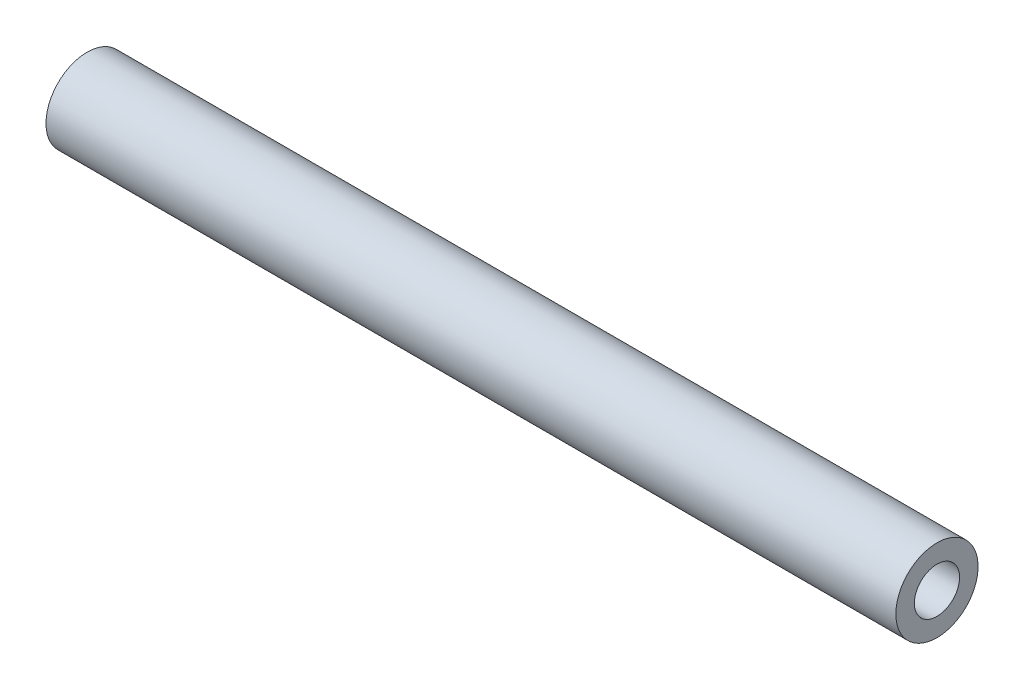
ISO-10303-21;
HEADER;
FILE_DESCRIPTION(('STEP AP214'),'2;1');
FILE_NAME('part.step','',(''),(''),'','','');
FILE_SCHEMA(('AUTOMOTIVE_DESIGN { 1 0 10303 214 1 1 1 1 }'));
ENDSEC;
DATA;
#1=APPLICATION_CONTEXT('core data for automotive mechanical design processes');
#2=APPLICATION_PROTOCOL_DEFINITION('international standard','automotive_design',2000,#1);
#3=PRODUCT_CONTEXT('',#1,'mechanical');
#4=PRODUCT('Part','Part','',(#3));
#5=PRODUCT_RELATED_PRODUCT_CATEGORY('part','',(#4));
#6=PRODUCT_DEFINITION_FORMATION('','',#4);
#7=PRODUCT_DEFINITION_CONTEXT('part definition',#1,'design');
#8=PRODUCT_DEFINITION('design','',#6,#7);
#9=PRODUCT_DEFINITION_SHAPE('','',#8);
#10=(LENGTH_UNIT() NAMED_UNIT(*) SI_UNIT(.MILLI.,.METRE.));
#11=(NAMED_UNIT(*) PLANE_ANGLE_UNIT() SI_UNIT($,.RADIAN.));
#12=(NAMED_UNIT(*) SI_UNIT($,.STERADIAN.) SOLID_ANGLE_UNIT());
#13=UNCERTAINTY_MEASURE_WITH_UNIT(LENGTH_MEASURE(1.E-05),#10,'distance_accuracy_value','');
#14=(GEOMETRIC_REPRESENTATION_CONTEXT(3) GLOBAL_UNCERTAINTY_ASSIGNED_CONTEXT((#13)) GLOBAL_UNIT_ASSIGNED_CONTEXT((#10,
#11,#12)) REPRESENTATION_CONTEXT('',''));
#15=CARTESIAN_POINT('',(0.,0.,0.));
#16=DIRECTION('',(0.,0.,1.));
#17=DIRECTION('',(1.,0.,0.));
#18=AXIS2_PLACEMENT_3D('',#15,#16,#17);
#19=CARTESIAN_POINT('',(-32.,-12.,-20.));
#20=DIRECTION('',(-1.,0.,0.));
#21=DIRECTION('',(0.,0.,1.));
#22=AXIS2_PLACEMENT_3D('',#19,#20,#21);
#23=CYLINDRICAL_SURFACE('',#22,1.65);
#24=CARTESIAN_POINT('',(31.,-12.,-20.));
#25=DIRECTION('',(-1.,0.,0.));
#26=DIRECTION('',(0.,0.,1.));
#27=AXIS2_PLACEMENT_3D('',#24,#25,#26);
#28=CIRCLE('',#27,1.65);
#29=CARTESIAN_POINT('',(31.,-12.,-18.35));
#30=VERTEX_POINT('',#29);
#31=EDGE_CURVE('E27',#30,#30,#28,.T.);
#32=ORIENTED_EDGE('',*,*,#31,.F.);
#33=EDGE_LOOP('',(#32));
#34=FACE_BOUND('',#33,.T.);
#35=CARTESIAN_POINT('',(-31.,-12.,-20.));
#36=DIRECTION('',(-1.,0.,0.));
#37=DIRECTION('',(0.,0.,1.));
#38=AXIS2_PLACEMENT_3D('',#35,#36,#37);
#39=CIRCLE('',#38,1.65);
#40=CARTESIAN_POINT('',(-31.,-12.,-18.35));
#41=VERTEX_POINT('',#40);
#42=EDGE_CURVE('E18',#41,#41,#39,.T.);
#43=ORIENTED_EDGE('',*,*,#42,.T.);
#44=EDGE_LOOP('',(#43));
#45=FACE_BOUND('',#44,.T.);
#46=ADVANCED_FACE('F15',(#34,#45),#23,.F.);
#47=CARTESIAN_POINT('',(-31.,-12.,-20.));
#48=DIRECTION('',(1.,0.,0.));
#49=DIRECTION('',(0.,0.,-1.));
#50=AXIS2_PLACEMENT_3D('',#47,#48,#49);
#51=PLANE('',#50);
#52=ORIENTED_EDGE('',*,*,#42,.F.);
#53=EDGE_LOOP('',(#52));
#54=FACE_BOUND('',#53,.T.);
#55=CARTESIAN_POINT('',(-31.,-12.,-20.));
#56=DIRECTION('',(-1.,0.,0.));
#57=DIRECTION('',(0.,0.,1.));
#58=AXIS2_PLACEMENT_3D('',#55,#56,#57);
#59=CIRCLE('',#58,3.);
#60=CARTESIAN_POINT('',(-31.,-12.,-17.));
#61=VERTEX_POINT('',#60);
#62=EDGE_CURVE('E22',#61,#61,#59,.F.);
#63=ORIENTED_EDGE('',*,*,#62,.F.);
#64=EDGE_LOOP('',(#63));
#65=FACE_BOUND('',#64,.T.);
#66=ADVANCED_FACE('F36',(#54,#65),#51,.F.);
#67=CARTESIAN_POINT('',(31.,-12.,-20.));
#68=DIRECTION('',(1.,0.,0.));
#69=DIRECTION('',(0.,0.,-1.));
#70=AXIS2_PLACEMENT_3D('',#67,#68,#69);
#71=PLANE('',#70);
#72=ORIENTED_EDGE('',*,*,#31,.T.);
#73=EDGE_LOOP('',(#72));
#74=FACE_BOUND('',#73,.T.);
#75=CARTESIAN_POINT('',(31.,-12.,-20.));
#76=DIRECTION('',(-1.,0.,0.));
#77=DIRECTION('',(0.,0.,1.));
#78=AXIS2_PLACEMENT_3D('',#75,#76,#77);
#79=CIRCLE('',#78,3.);
#80=CARTESIAN_POINT('',(31.,-12.,-17.));
#81=VERTEX_POINT('',#80);
#82=EDGE_CURVE('E10',#81,#81,#79,.T.);
#83=ORIENTED_EDGE('',*,*,#82,.F.);
#84=EDGE_LOOP('',(#83));
#85=FACE_BOUND('',#84,.T.);
#86=ADVANCED_FACE('F39',(#74,#85),#71,.T.);
#87=CARTESIAN_POINT('',(-31.,-12.,-20.));
#88=DIRECTION('',(-1.,0.,0.));
#89=DIRECTION('',(0.,0.,1.));
#90=AXIS2_PLACEMENT_3D('',#87,#88,#89);
#91=CYLINDRICAL_SURFACE('',#90,3.);
#92=ORIENTED_EDGE('',*,*,#82,.T.);
#93=EDGE_LOOP('',(#92));
#94=FACE_BOUND('',#93,.T.);
#95=ORIENTED_EDGE('',*,*,#62,.T.);
#96=EDGE_LOOP('',(#95));
#97=FACE_BOUND('',#96,.T.);
#98=ADVANCED_FACE('F42',(#94,#97),#91,.T.);
#99=CLOSED_SHELL('',(#46,#66,#86,#98));
#100=MANIFOLD_SOLID_BREP('B1',#99);
#101=ADVANCED_BREP_SHAPE_REPRESENTATION('',(#18,#100),#14);
#102=SHAPE_DEFINITION_REPRESENTATION(#9,#101);
ENDSEC;
END-ISO-10303-21;
